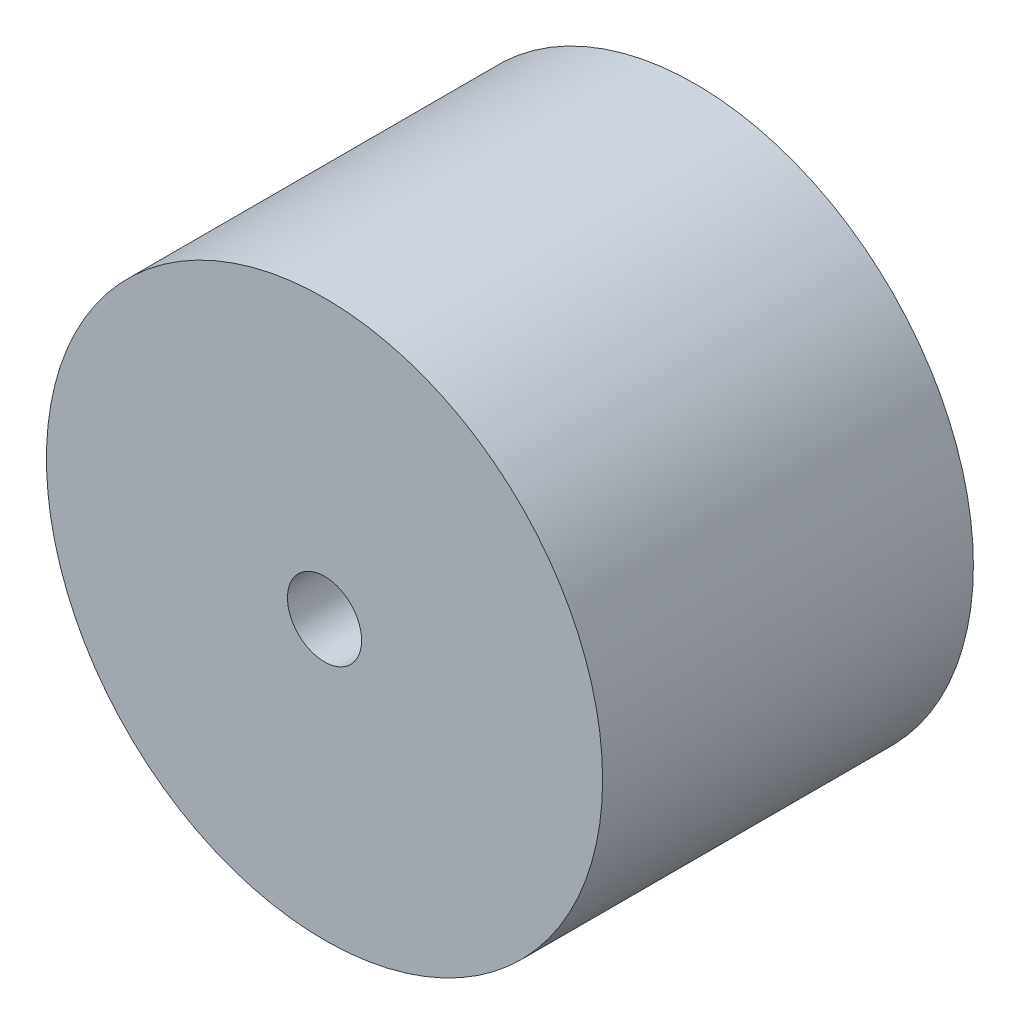
ISO-10303-21;
HEADER;
FILE_DESCRIPTION(('STEP AP214'),'2;1');
FILE_NAME('part.step','',(''),(''),'','','');
FILE_SCHEMA(('AUTOMOTIVE_DESIGN { 1 0 10303 214 1 1 1 1 }'));
ENDSEC;
DATA;
#1=APPLICATION_CONTEXT('core data for automotive mechanical design processes');
#2=APPLICATION_PROTOCOL_DEFINITION('international standard','automotive_design',2000,#1);
#3=PRODUCT_CONTEXT('',#1,'mechanical');
#4=PRODUCT('Part','Part','',(#3));
#5=PRODUCT_RELATED_PRODUCT_CATEGORY('part','',(#4));
#6=PRODUCT_DEFINITION_FORMATION('','',#4);
#7=PRODUCT_DEFINITION_CONTEXT('part definition',#1,'design');
#8=PRODUCT_DEFINITION('design','',#6,#7);
#9=PRODUCT_DEFINITION_SHAPE('','',#8);
#10=(LENGTH_UNIT() NAMED_UNIT(*) SI_UNIT(.MILLI.,.METRE.));
#11=(NAMED_UNIT(*) PLANE_ANGLE_UNIT() SI_UNIT($,.RADIAN.));
#12=(NAMED_UNIT(*) SI_UNIT($,.STERADIAN.) SOLID_ANGLE_UNIT());
#13=UNCERTAINTY_MEASURE_WITH_UNIT(LENGTH_MEASURE(1.E-05),#10,'distance_accuracy_value','');
#14=(GEOMETRIC_REPRESENTATION_CONTEXT(3) GLOBAL_UNCERTAINTY_ASSIGNED_CONTEXT((#13)) GLOBAL_UNIT_ASSIGNED_CONTEXT((#10,
#11,#12)) REPRESENTATION_CONTEXT('',''));
#15=CARTESIAN_POINT('',(0.,0.,0.));
#16=DIRECTION('',(0.,0.,1.));
#17=DIRECTION('',(1.,0.,0.));
#18=AXIS2_PLACEMENT_3D('',#15,#16,#17);
#19=CARTESIAN_POINT('',(0.,0.,40.));
#20=DIRECTION('',(0.,0.,1.));
#21=DIRECTION('',(1.,0.,0.));
#22=AXIS2_PLACEMENT_3D('',#19,#20,#21);
#23=PLANE('',#22);
#24=CARTESIAN_POINT('',(0.,0.,40.));
#25=DIRECTION('',(0.,0.,1.));
#26=DIRECTION('',(1.,0.,0.));
#27=AXIS2_PLACEMENT_3D('',#24,#25,#26);
#28=CIRCLE('',#27,30.);
#29=CARTESIAN_POINT('',(30.,0.,40.));
#30=VERTEX_POINT('',#29);
#31=EDGE_CURVE('E10',#30,#30,#28,.T.);
#32=ORIENTED_EDGE('',*,*,#31,.T.);
#33=EDGE_LOOP('',(#32));
#34=FACE_BOUND('',#33,.T.);
#35=CARTESIAN_POINT('',(0.,0.,40.));
#36=DIRECTION('',(0.,0.,1.));
#37=DIRECTION('',(1.,0.,0.));
#38=AXIS2_PLACEMENT_3D('',#35,#36,#37);
#39=CIRCLE('',#38,4.);
#40=CARTESIAN_POINT('',(4.,0.,40.));
#41=VERTEX_POINT('',#40);
#42=EDGE_CURVE('E50',#41,#41,#39,.T.);
#43=ORIENTED_EDGE('',*,*,#42,.F.);
#44=EDGE_LOOP('',(#43));
#45=FACE_BOUND('',#44,.T.);
#46=ADVANCED_FACE('F37',(#34,#45),#23,.T.);
#47=CARTESIAN_POINT('',(0.,0.,0.));
#48=DIRECTION('',(0.,0.,1.));
#49=DIRECTION('',(1.,0.,0.));
#50=AXIS2_PLACEMENT_3D('',#47,#48,#49);
#51=PLANE('',#50);
#52=CARTESIAN_POINT('',(0.,0.,0.));
#53=DIRECTION('',(0.,0.,1.));
#54=DIRECTION('',(1.,0.,0.));
#55=AXIS2_PLACEMENT_3D('',#52,#53,#54);
#56=CIRCLE('',#55,30.);
#57=CARTESIAN_POINT('',(30.,0.,0.));
#58=VERTEX_POINT('',#57);
#59=EDGE_CURVE('E41',#58,#58,#56,.T.);
#60=ORIENTED_EDGE('',*,*,#59,.F.);
#61=EDGE_LOOP('',(#60));
#62=FACE_BOUND('',#61,.T.);
#63=CARTESIAN_POINT('',(0.,0.,0.));
#64=DIRECTION('',(0.,0.,1.));
#65=DIRECTION('',(1.,0.,0.));
#66=AXIS2_PLACEMENT_3D('',#63,#64,#65);
#67=CIRCLE('',#66,4.);
#68=CARTESIAN_POINT('',(4.,0.,0.));
#69=VERTEX_POINT('',#68);
#70=EDGE_CURVE('E52',#69,#69,#67,.T.);
#71=ORIENTED_EDGE('',*,*,#70,.T.);
#72=EDGE_LOOP('',(#71));
#73=FACE_BOUND('',#72,.T.);
#74=ADVANCED_FACE('F64',(#62,#73),#51,.F.);
#75=CARTESIAN_POINT('',(0.,0.,40.));
#76=DIRECTION('',(0.,0.,-1.));
#77=DIRECTION('',(-1.,0.,0.));
#78=AXIS2_PLACEMENT_3D('',#75,#76,#77);
#79=CYLINDRICAL_SURFACE('',#78,30.);
#80=ORIENTED_EDGE('',*,*,#31,.F.);
#81=EDGE_LOOP('',(#80));
#82=FACE_BOUND('',#81,.T.);
#83=ORIENTED_EDGE('',*,*,#59,.T.);
#84=EDGE_LOOP('',(#83));
#85=FACE_BOUND('',#84,.T.);
#86=ADVANCED_FACE('F39',(#82,#85),#79,.T.);
#87=CARTESIAN_POINT('',(0.,0.,40.));
#88=DIRECTION('',(0.,0.,-1.));
#89=DIRECTION('',(-1.,0.,0.));
#90=AXIS2_PLACEMENT_3D('',#87,#88,#89);
#91=CYLINDRICAL_SURFACE('',#90,4.);
#92=ORIENTED_EDGE('',*,*,#42,.T.);
#93=EDGE_LOOP('',(#92));
#94=FACE_BOUND('',#93,.T.);
#95=ORIENTED_EDGE('',*,*,#70,.F.);
#96=EDGE_LOOP('',(#95));
#97=FACE_BOUND('',#96,.T.);
#98=ADVANCED_FACE('F60',(#94,#97),#91,.F.);
#99=CLOSED_SHELL('',(#46,#74,#86,#98));
#100=MANIFOLD_SOLID_BREP('B2',#99);
#101=ADVANCED_BREP_SHAPE_REPRESENTATION('',(#18,#100),#14);
#102=SHAPE_DEFINITION_REPRESENTATION(#9,#101);
ENDSEC;
END-ISO-10303-21;
